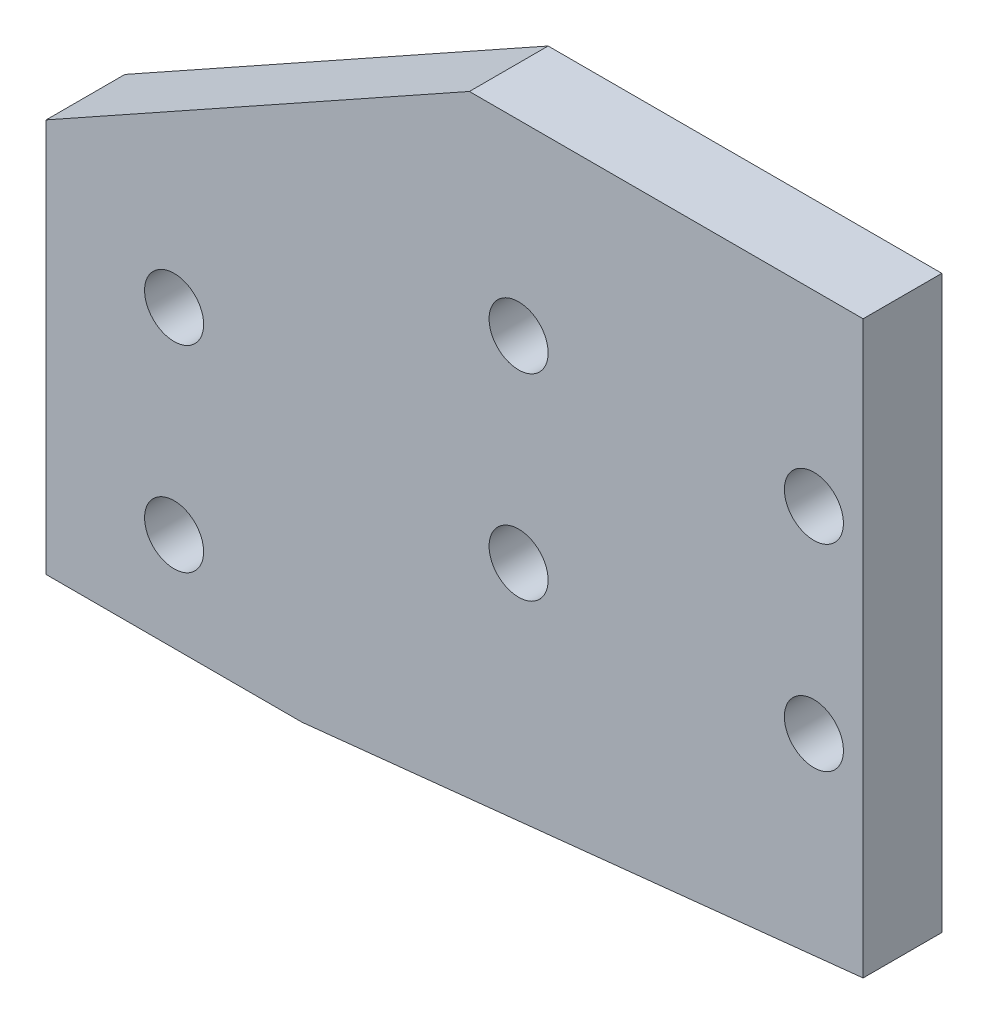
ISO-10303-21;
HEADER;
FILE_DESCRIPTION(('STEP AP214'),'2;1');
FILE_NAME('part.step','',(''),(''),'','','');
FILE_SCHEMA(('AUTOMOTIVE_DESIGN { 1 0 10303 214 1 1 1 1 }'));
ENDSEC;
DATA;
#1=APPLICATION_CONTEXT('core data for automotive mechanical design processes');
#2=APPLICATION_PROTOCOL_DEFINITION('international standard','automotive_design',2000,#1);
#3=PRODUCT_CONTEXT('',#1,'mechanical');
#4=PRODUCT('Part','Part','',(#3));
#5=PRODUCT_RELATED_PRODUCT_CATEGORY('part','',(#4));
#6=PRODUCT_DEFINITION_FORMATION('','',#4);
#7=PRODUCT_DEFINITION_CONTEXT('part definition',#1,'design');
#8=PRODUCT_DEFINITION('design','',#6,#7);
#9=PRODUCT_DEFINITION_SHAPE('','',#8);
#10=(LENGTH_UNIT() NAMED_UNIT(*) SI_UNIT(.MILLI.,.METRE.));
#11=(NAMED_UNIT(*) PLANE_ANGLE_UNIT() SI_UNIT($,.RADIAN.));
#12=(NAMED_UNIT(*) SI_UNIT($,.STERADIAN.) SOLID_ANGLE_UNIT());
#13=UNCERTAINTY_MEASURE_WITH_UNIT(LENGTH_MEASURE(1.E-05),#10,'distance_accuracy_value','');
#14=(GEOMETRIC_REPRESENTATION_CONTEXT(3) GLOBAL_UNCERTAINTY_ASSIGNED_CONTEXT((#13)) GLOBAL_UNIT_ASSIGNED_CONTEXT((#10,
#11,#12)) REPRESENTATION_CONTEXT('',''));
#15=CARTESIAN_POINT('',(0.,0.,0.));
#16=DIRECTION('',(0.,0.,1.));
#17=DIRECTION('',(1.,0.,0.));
#18=AXIS2_PLACEMENT_3D('',#15,#16,#17);
#19=CARTESIAN_POINT('',(0.,0.,4.));
#20=DIRECTION('',(0.,0.,1.));
#21=DIRECTION('',(1.,0.,0.));
#22=AXIS2_PLACEMENT_3D('',#19,#20,#21);
#23=PLANE('',#22);
#24=CARTESIAN_POINT('',(24.,22.5,4.));
#25=DIRECTION('',(0.,0.,1.));
#26=DIRECTION('',(-1.,0.,0.));
#27=AXIS2_PLACEMENT_3D('',#24,#25,#26);
#28=CIRCLE('',#27,1.5);
#29=CARTESIAN_POINT('',(22.5,22.5,4.));
#30=VERTEX_POINT('',#29);
#31=EDGE_CURVE('E202',#30,#30,#28,.T.);
#32=ORIENTED_EDGE('',*,*,#31,.F.);
#33=EDGE_LOOP('',(#32));
#34=FACE_BOUND('',#33,.T.);
#35=CARTESIAN_POINT('',(24.,12.5,4.));
#36=DIRECTION('',(0.,0.,1.));
#37=DIRECTION('',(1.,0.,0.));
#38=AXIS2_PLACEMENT_3D('',#35,#36,#37);
#39=CIRCLE('',#38,1.5);
#40=CARTESIAN_POINT('',(25.5,12.5,4.));
#41=VERTEX_POINT('',#40);
#42=EDGE_CURVE('E220',#41,#41,#39,.T.);
#43=ORIENTED_EDGE('',*,*,#42,.F.);
#44=EDGE_LOOP('',(#43));
#45=FACE_BOUND('',#44,.T.);
#46=CARTESIAN_POINT('',(6.5,15.,4.));
#47=DIRECTION('',(0.,0.,1.));
#48=DIRECTION('',(1.,0.,0.));
#49=AXIS2_PLACEMENT_3D('',#46,#47,#48);
#50=CIRCLE('',#49,1.5);
#51=CARTESIAN_POINT('',(8.,15.,4.));
#52=VERTEX_POINT('',#51);
#53=EDGE_CURVE('E128',#52,#52,#50,.T.);
#54=ORIENTED_EDGE('',*,*,#53,.F.);
#55=EDGE_LOOP('',(#54));
#56=FACE_BOUND('',#55,.T.);
#57=DIRECTION('',(0.,-1.,0.));
#58=VECTOR('',#57,1.);
#59=CARTESIAN_POINT('',(0.,20.,4.));
#60=LINE('',#59,#58);
#61=CARTESIAN_POINT('',(0.,20.,4.));
#62=VERTEX_POINT('',#61);
#63=CARTESIAN_POINT('',(0.,0.,4.));
#64=VERTEX_POINT('',#63);
#65=EDGE_CURVE('E139',#62,#64,#60,.T.);
#66=ORIENTED_EDGE('',*,*,#65,.T.);
#67=DIRECTION('',(1.,0.,0.));
#68=VECTOR('',#67,1.);
#69=CARTESIAN_POINT('',(0.,0.,4.));
#70=LINE('',#69,#68);
#71=CARTESIAN_POINT('',(13.,0.,4.));
#72=VERTEX_POINT('',#71);
#73=EDGE_CURVE('E92',#64,#72,#70,.T.);
#74=ORIENTED_EDGE('',*,*,#73,.T.);
#75=DIRECTION('',(0.994505452921406,0.104684784518043,0.));
#76=VECTOR('',#75,1.);
#77=CARTESIAN_POINT('',(13.,0.,4.));
#78=LINE('',#77,#76);
#79=CARTESIAN_POINT('',(41.5,3.,4.));
#80=VERTEX_POINT('',#79);
#81=EDGE_CURVE('E107',#72,#80,#78,.T.);
#82=ORIENTED_EDGE('',*,*,#81,.T.);
#83=DIRECTION('',(0.,1.,0.));
#84=VECTOR('',#83,1.);
#85=CARTESIAN_POINT('',(41.5,3.,4.));
#86=LINE('',#85,#84);
#87=CARTESIAN_POINT('',(41.5,32.,4.));
#88=VERTEX_POINT('',#87);
#89=EDGE_CURVE('E105',#80,#88,#86,.T.);
#90=ORIENTED_EDGE('',*,*,#89,.T.);
#91=DIRECTION('',(-1.,0.,0.));
#92=VECTOR('',#91,1.);
#93=CARTESIAN_POINT('',(41.5,32.,4.));
#94=LINE('',#93,#92);
#95=CARTESIAN_POINT('',(21.5,32.,4.));
#96=VERTEX_POINT('',#95);
#97=EDGE_CURVE('E106',#88,#96,#94,.T.);
#98=ORIENTED_EDGE('',*,*,#97,.T.);
#99=DIRECTION('',(-0.873197702014912,-0.487366159264137,0.));
#100=VECTOR('',#99,1.);
#101=CARTESIAN_POINT('',(21.5,32.,4.));
#102=LINE('',#101,#100);
#103=EDGE_CURVE('E59',#96,#62,#102,.T.);
#104=ORIENTED_EDGE('',*,*,#103,.T.);
#105=EDGE_LOOP('',(#66,#74,#82,#90,#98,#104));
#106=FACE_BOUND('',#105,.T.);
#107=CARTESIAN_POINT('',(6.5,5.,4.));
#108=DIRECTION('',(0.,0.,1.));
#109=DIRECTION('',(-1.,0.,0.));
#110=AXIS2_PLACEMENT_3D('',#107,#108,#109);
#111=CIRCLE('',#110,1.5);
#112=CARTESIAN_POINT('',(5.,5.,4.));
#113=VERTEX_POINT('',#112);
#114=EDGE_CURVE('E224',#113,#113,#111,.T.);
#115=ORIENTED_EDGE('',*,*,#114,.F.);
#116=EDGE_LOOP('',(#115));
#117=FACE_BOUND('',#116,.T.);
#118=CARTESIAN_POINT('',(39.,12.5,4.));
#119=DIRECTION('',(0.,0.,1.));
#120=DIRECTION('',(-1.,0.,0.));
#121=AXIS2_PLACEMENT_3D('',#118,#119,#120);
#122=CIRCLE('',#121,1.5);
#123=CARTESIAN_POINT('',(37.5,12.5,4.));
#124=VERTEX_POINT('',#123);
#125=EDGE_CURVE('E211',#124,#124,#122,.T.);
#126=ORIENTED_EDGE('',*,*,#125,.F.);
#127=EDGE_LOOP('',(#126));
#128=FACE_BOUND('',#127,.T.);
#129=CARTESIAN_POINT('',(39.,22.5,4.));
#130=DIRECTION('',(0.,0.,1.));
#131=DIRECTION('',(1.,0.,0.));
#132=AXIS2_PLACEMENT_3D('',#129,#130,#131);
#133=CIRCLE('',#132,1.5);
#134=CARTESIAN_POINT('',(40.5,22.5,4.));
#135=VERTEX_POINT('',#134);
#136=EDGE_CURVE('E198',#135,#135,#133,.T.);
#137=ORIENTED_EDGE('',*,*,#136,.F.);
#138=EDGE_LOOP('',(#137));
#139=FACE_BOUND('',#138,.T.);
#140=ADVANCED_FACE('F41',(#34,#45,#56,#106,#117,#128,#139),#23,.T.);
#141=CARTESIAN_POINT('',(0.,0.,0.));
#142=DIRECTION('',(0.,0.,1.));
#143=DIRECTION('',(1.,0.,0.));
#144=AXIS2_PLACEMENT_3D('',#141,#142,#143);
#145=PLANE('',#144);
#146=DIRECTION('',(0.,-1.,0.));
#147=VECTOR('',#146,1.);
#148=CARTESIAN_POINT('',(0.,20.,0.));
#149=LINE('',#148,#147);
#150=CARTESIAN_POINT('',(0.,20.,0.));
#151=VERTEX_POINT('',#150);
#152=CARTESIAN_POINT('',(0.,0.,0.));
#153=VERTEX_POINT('',#152);
#154=EDGE_CURVE('E127',#151,#153,#149,.T.);
#155=ORIENTED_EDGE('',*,*,#154,.F.);
#156=DIRECTION('',(-0.873197702014912,-0.487366159264137,0.));
#157=VECTOR('',#156,1.);
#158=CARTESIAN_POINT('',(21.5,32.,0.));
#159=LINE('',#158,#157);
#160=CARTESIAN_POINT('',(21.5,32.,0.));
#161=VERTEX_POINT('',#160);
#162=EDGE_CURVE('E87',#161,#151,#159,.T.);
#163=ORIENTED_EDGE('',*,*,#162,.F.);
#164=DIRECTION('',(-1.,0.,0.));
#165=VECTOR('',#164,1.);
#166=CARTESIAN_POINT('',(41.5,32.,0.));
#167=LINE('',#166,#165);
#168=CARTESIAN_POINT('',(41.5,32.,0.));
#169=VERTEX_POINT('',#168);
#170=EDGE_CURVE('E83',#169,#161,#167,.T.);
#171=ORIENTED_EDGE('',*,*,#170,.F.);
#172=DIRECTION('',(0.,1.,0.));
#173=VECTOR('',#172,1.);
#174=CARTESIAN_POINT('',(41.5,3.,0.));
#175=LINE('',#174,#173);
#176=CARTESIAN_POINT('',(41.5,3.,0.));
#177=VERTEX_POINT('',#176);
#178=EDGE_CURVE('E117',#177,#169,#175,.T.);
#179=ORIENTED_EDGE('',*,*,#178,.F.);
#180=DIRECTION('',(0.994505452921406,0.104684784518043,0.));
#181=VECTOR('',#180,1.);
#182=CARTESIAN_POINT('',(13.,0.,0.));
#183=LINE('',#182,#181);
#184=CARTESIAN_POINT('',(13.,0.,0.));
#185=VERTEX_POINT('',#184);
#186=EDGE_CURVE('E134',#185,#177,#183,.T.);
#187=ORIENTED_EDGE('',*,*,#186,.F.);
#188=DIRECTION('',(1.,0.,0.));
#189=VECTOR('',#188,1.);
#190=CARTESIAN_POINT('',(0.,0.,0.));
#191=LINE('',#190,#189);
#192=EDGE_CURVE('E129',#153,#185,#191,.T.);
#193=ORIENTED_EDGE('',*,*,#192,.F.);
#194=EDGE_LOOP('',(#155,#163,#171,#179,#187,#193));
#195=FACE_BOUND('',#194,.T.);
#196=CARTESIAN_POINT('',(6.5,15.,0.));
#197=DIRECTION('',(0.,0.,1.));
#198=DIRECTION('',(1.,0.,0.));
#199=AXIS2_PLACEMENT_3D('',#196,#197,#198);
#200=CIRCLE('',#199,1.5);
#201=CARTESIAN_POINT('',(8.,15.,0.));
#202=VERTEX_POINT('',#201);
#203=EDGE_CURVE('E227',#202,#202,#200,.T.);
#204=ORIENTED_EDGE('',*,*,#203,.T.);
#205=EDGE_LOOP('',(#204));
#206=FACE_BOUND('',#205,.T.);
#207=CARTESIAN_POINT('',(6.5,5.,0.));
#208=DIRECTION('',(0.,0.,1.));
#209=DIRECTION('',(-1.,0.,0.));
#210=AXIS2_PLACEMENT_3D('',#207,#208,#209);
#211=CIRCLE('',#210,1.5);
#212=CARTESIAN_POINT('',(5.,5.,0.));
#213=VERTEX_POINT('',#212);
#214=EDGE_CURVE('E219',#213,#213,#211,.T.);
#215=ORIENTED_EDGE('',*,*,#214,.T.);
#216=EDGE_LOOP('',(#215));
#217=FACE_BOUND('',#216,.T.);
#218=CARTESIAN_POINT('',(24.,12.5,0.));
#219=DIRECTION('',(0.,0.,1.));
#220=DIRECTION('',(1.,0.,0.));
#221=AXIS2_PLACEMENT_3D('',#218,#219,#220);
#222=CIRCLE('',#221,1.5);
#223=CARTESIAN_POINT('',(25.5,12.5,0.));
#224=VERTEX_POINT('',#223);
#225=EDGE_CURVE('E212',#224,#224,#222,.T.);
#226=ORIENTED_EDGE('',*,*,#225,.T.);
#227=EDGE_LOOP('',(#226));
#228=FACE_BOUND('',#227,.T.);
#229=CARTESIAN_POINT('',(39.,12.5,0.));
#230=DIRECTION('',(0.,0.,1.));
#231=DIRECTION('',(-1.,0.,0.));
#232=AXIS2_PLACEMENT_3D('',#229,#230,#231);
#233=CIRCLE('',#232,1.5);
#234=CARTESIAN_POINT('',(37.5,12.5,0.));
#235=VERTEX_POINT('',#234);
#236=EDGE_CURVE('E208',#235,#235,#233,.T.);
#237=ORIENTED_EDGE('',*,*,#236,.T.);
#238=EDGE_LOOP('',(#237));
#239=FACE_BOUND('',#238,.T.);
#240=CARTESIAN_POINT('',(24.,22.5,0.));
#241=DIRECTION('',(0.,0.,1.));
#242=DIRECTION('',(-1.,0.,0.));
#243=AXIS2_PLACEMENT_3D('',#240,#241,#242);
#244=CIRCLE('',#243,1.5);
#245=CARTESIAN_POINT('',(22.5,22.5,0.));
#246=VERTEX_POINT('',#245);
#247=EDGE_CURVE('E205',#246,#246,#244,.T.);
#248=ORIENTED_EDGE('',*,*,#247,.T.);
#249=EDGE_LOOP('',(#248));
#250=FACE_BOUND('',#249,.T.);
#251=CARTESIAN_POINT('',(39.,22.5,0.));
#252=DIRECTION('',(0.,0.,1.));
#253=DIRECTION('',(1.,0.,0.));
#254=AXIS2_PLACEMENT_3D('',#251,#252,#253);
#255=CIRCLE('',#254,1.5);
#256=CARTESIAN_POINT('',(40.5,22.5,0.));
#257=VERTEX_POINT('',#256);
#258=EDGE_CURVE('E200',#257,#257,#255,.T.);
#259=ORIENTED_EDGE('',*,*,#258,.T.);
#260=EDGE_LOOP('',(#259));
#261=FACE_BOUND('',#260,.T.);
#262=ADVANCED_FACE('F148',(#195,#206,#217,#228,#239,#250,#261),#145,.F.);
#263=CARTESIAN_POINT('',(0.,20.,4.));
#264=DIRECTION('',(1.,0.,0.));
#265=DIRECTION('',(0.,0.,-1.));
#266=AXIS2_PLACEMENT_3D('',#263,#264,#265);
#267=PLANE('',#266);
#268=ORIENTED_EDGE('',*,*,#154,.T.);
#269=DIRECTION('',(0.,0.,-1.));
#270=VECTOR('',#269,1.);
#271=CARTESIAN_POINT('',(0.,0.,4.));
#272=LINE('',#271,#270);
#273=EDGE_CURVE('E11',#64,#153,#272,.T.);
#274=ORIENTED_EDGE('',*,*,#273,.F.);
#275=ORIENTED_EDGE('',*,*,#65,.F.);
#276=DIRECTION('',(0.,0.,-1.));
#277=VECTOR('',#276,1.);
#278=CARTESIAN_POINT('',(0.,20.,4.));
#279=LINE('',#278,#277);
#280=EDGE_CURVE('E124',#62,#151,#279,.T.);
#281=ORIENTED_EDGE('',*,*,#280,.T.);
#282=EDGE_LOOP('',(#268,#274,#275,#281));
#283=FACE_BOUND('',#282,.T.);
#284=ADVANCED_FACE('F43',(#283),#267,.F.);
#285=CARTESIAN_POINT('',(0.,0.,4.));
#286=DIRECTION('',(0.,1.,0.));
#287=DIRECTION('',(0.,0.,1.));
#288=AXIS2_PLACEMENT_3D('',#285,#286,#287);
#289=PLANE('',#288);
#290=ORIENTED_EDGE('',*,*,#192,.T.);
#291=DIRECTION('',(0.,0.,-1.));
#292=VECTOR('',#291,1.);
#293=CARTESIAN_POINT('',(13.,0.,4.));
#294=LINE('',#293,#292);
#295=EDGE_CURVE('E49',#72,#185,#294,.T.);
#296=ORIENTED_EDGE('',*,*,#295,.F.);
#297=ORIENTED_EDGE('',*,*,#73,.F.);
#298=ORIENTED_EDGE('',*,*,#273,.T.);
#299=EDGE_LOOP('',(#290,#296,#297,#298));
#300=FACE_BOUND('',#299,.T.);
#301=ADVANCED_FACE('F306',(#300),#289,.F.);
#302=CARTESIAN_POINT('',(13.,0.,4.));
#303=DIRECTION('',(-0.104684784518043,0.994505452921406,0.));
#304=DIRECTION('',(-0.994505452921406,-0.104684784518043,0.));
#305=AXIS2_PLACEMENT_3D('',#302,#303,#304);
#306=PLANE('',#305);
#307=ORIENTED_EDGE('',*,*,#186,.T.);
#308=DIRECTION('',(0.,0.,-1.));
#309=VECTOR('',#308,1.);
#310=CARTESIAN_POINT('',(41.5,3.,4.));
#311=LINE('',#310,#309);
#312=EDGE_CURVE('E119',#80,#177,#311,.T.);
#313=ORIENTED_EDGE('',*,*,#312,.F.);
#314=ORIENTED_EDGE('',*,*,#81,.F.);
#315=ORIENTED_EDGE('',*,*,#295,.T.);
#316=EDGE_LOOP('',(#307,#313,#314,#315));
#317=FACE_BOUND('',#316,.T.);
#318=ADVANCED_FACE('F141',(#317),#306,.F.);
#319=CARTESIAN_POINT('',(41.5,3.,4.));
#320=DIRECTION('',(-1.,0.,0.));
#321=DIRECTION('',(0.,-1.,0.));
#322=AXIS2_PLACEMENT_3D('',#319,#320,#321);
#323=PLANE('',#322);
#324=ORIENTED_EDGE('',*,*,#178,.T.);
#325=DIRECTION('',(0.,0.,-1.));
#326=VECTOR('',#325,1.);
#327=CARTESIAN_POINT('',(41.5,32.,4.));
#328=LINE('',#327,#326);
#329=EDGE_CURVE('E114',#88,#169,#328,.T.);
#330=ORIENTED_EDGE('',*,*,#329,.F.);
#331=ORIENTED_EDGE('',*,*,#89,.F.);
#332=ORIENTED_EDGE('',*,*,#312,.T.);
#333=EDGE_LOOP('',(#324,#330,#331,#332));
#334=FACE_BOUND('',#333,.T.);
#335=ADVANCED_FACE('F111',(#334),#323,.F.);
#336=CARTESIAN_POINT('',(41.5,32.,4.));
#337=DIRECTION('',(0.,-1.,0.));
#338=DIRECTION('',(0.,0.,-1.));
#339=AXIS2_PLACEMENT_3D('',#336,#337,#338);
#340=PLANE('',#339);
#341=ORIENTED_EDGE('',*,*,#170,.T.);
#342=DIRECTION('',(0.,0.,-1.));
#343=VECTOR('',#342,1.);
#344=CARTESIAN_POINT('',(21.5,32.,4.));
#345=LINE('',#344,#343);
#346=EDGE_CURVE('E120',#96,#161,#345,.T.);
#347=ORIENTED_EDGE('',*,*,#346,.F.);
#348=ORIENTED_EDGE('',*,*,#97,.F.);
#349=ORIENTED_EDGE('',*,*,#329,.T.);
#350=EDGE_LOOP('',(#341,#347,#348,#349));
#351=FACE_BOUND('',#350,.T.);
#352=ADVANCED_FACE('F118',(#351),#340,.F.);
#353=CARTESIAN_POINT('',(21.5,32.,4.));
#354=DIRECTION('',(0.487366159264137,-0.873197702014912,0.));
#355=DIRECTION('',(0.873197702014912,0.487366159264137,0.));
#356=AXIS2_PLACEMENT_3D('',#353,#354,#355);
#357=PLANE('',#356);
#358=ORIENTED_EDGE('',*,*,#162,.T.);
#359=ORIENTED_EDGE('',*,*,#280,.F.);
#360=ORIENTED_EDGE('',*,*,#103,.F.);
#361=ORIENTED_EDGE('',*,*,#346,.T.);
#362=EDGE_LOOP('',(#358,#359,#360,#361));
#363=FACE_BOUND('',#362,.T.);
#364=ADVANCED_FACE('F151',(#363),#357,.F.);
#365=CARTESIAN_POINT('',(6.5,15.,4.));
#366=DIRECTION('',(0.,0.,-1.));
#367=DIRECTION('',(-1.,0.,0.));
#368=AXIS2_PLACEMENT_3D('',#365,#366,#367);
#369=CYLINDRICAL_SURFACE('',#368,1.5);
#370=ORIENTED_EDGE('',*,*,#53,.T.);
#371=EDGE_LOOP('',(#370));
#372=FACE_BOUND('',#371,.T.);
#373=ORIENTED_EDGE('',*,*,#203,.F.);
#374=EDGE_LOOP('',(#373));
#375=FACE_BOUND('',#374,.T.);
#376=ADVANCED_FACE('F153',(#372,#375),#369,.F.);
#377=CARTESIAN_POINT('',(6.5,5.,4.));
#378=DIRECTION('',(0.,0.,-1.));
#379=DIRECTION('',(-1.,0.,0.));
#380=AXIS2_PLACEMENT_3D('',#377,#378,#379);
#381=CYLINDRICAL_SURFACE('',#380,1.5);
#382=ORIENTED_EDGE('',*,*,#114,.T.);
#383=EDGE_LOOP('',(#382));
#384=FACE_BOUND('',#383,.T.);
#385=ORIENTED_EDGE('',*,*,#214,.F.);
#386=EDGE_LOOP('',(#385));
#387=FACE_BOUND('',#386,.T.);
#388=ADVANCED_FACE('F157',(#384,#387),#381,.F.);
#389=CARTESIAN_POINT('',(24.,12.5,4.));
#390=DIRECTION('',(0.,0.,-1.));
#391=DIRECTION('',(-1.,0.,0.));
#392=AXIS2_PLACEMENT_3D('',#389,#390,#391);
#393=CYLINDRICAL_SURFACE('',#392,1.5);
#394=ORIENTED_EDGE('',*,*,#42,.T.);
#395=EDGE_LOOP('',(#394));
#396=FACE_BOUND('',#395,.T.);
#397=ORIENTED_EDGE('',*,*,#225,.F.);
#398=EDGE_LOOP('',(#397));
#399=FACE_BOUND('',#398,.T.);
#400=ADVANCED_FACE('F173',(#396,#399),#393,.F.);
#401=CARTESIAN_POINT('',(39.,12.5,4.));
#402=DIRECTION('',(0.,0.,-1.));
#403=DIRECTION('',(-1.,0.,0.));
#404=AXIS2_PLACEMENT_3D('',#401,#402,#403);
#405=CYLINDRICAL_SURFACE('',#404,1.5);
#406=ORIENTED_EDGE('',*,*,#125,.T.);
#407=EDGE_LOOP('',(#406));
#408=FACE_BOUND('',#407,.T.);
#409=ORIENTED_EDGE('',*,*,#236,.F.);
#410=EDGE_LOOP('',(#409));
#411=FACE_BOUND('',#410,.T.);
#412=ADVANCED_FACE('F180',(#408,#411),#405,.F.);
#413=CARTESIAN_POINT('',(24.,22.5,4.));
#414=DIRECTION('',(0.,0.,-1.));
#415=DIRECTION('',(-1.,0.,0.));
#416=AXIS2_PLACEMENT_3D('',#413,#414,#415);
#417=CYLINDRICAL_SURFACE('',#416,1.5);
#418=ORIENTED_EDGE('',*,*,#31,.T.);
#419=EDGE_LOOP('',(#418));
#420=FACE_BOUND('',#419,.T.);
#421=ORIENTED_EDGE('',*,*,#247,.F.);
#422=EDGE_LOOP('',(#421));
#423=FACE_BOUND('',#422,.T.);
#424=ADVANCED_FACE('F181',(#420,#423),#417,.F.);
#425=CARTESIAN_POINT('',(39.,22.5,4.));
#426=DIRECTION('',(0.,0.,-1.));
#427=DIRECTION('',(-1.,0.,0.));
#428=AXIS2_PLACEMENT_3D('',#425,#426,#427);
#429=CYLINDRICAL_SURFACE('',#428,1.5);
#430=ORIENTED_EDGE('',*,*,#136,.T.);
#431=EDGE_LOOP('',(#430));
#432=FACE_BOUND('',#431,.T.);
#433=ORIENTED_EDGE('',*,*,#258,.F.);
#434=EDGE_LOOP('',(#433));
#435=FACE_BOUND('',#434,.T.);
#436=ADVANCED_FACE('F189',(#432,#435),#429,.F.);
#437=CLOSED_SHELL('',(#140,#262,#284,#301,#318,#335,#352,#364,#376,#388,#400,#412,#424,#436));
#438=MANIFOLD_SOLID_BREP('B2',#437);
#439=ADVANCED_BREP_SHAPE_REPRESENTATION('',(#18,#438),#14);
#440=SHAPE_DEFINITION_REPRESENTATION(#9,#439);
ENDSEC;
END-ISO-10303-21;
